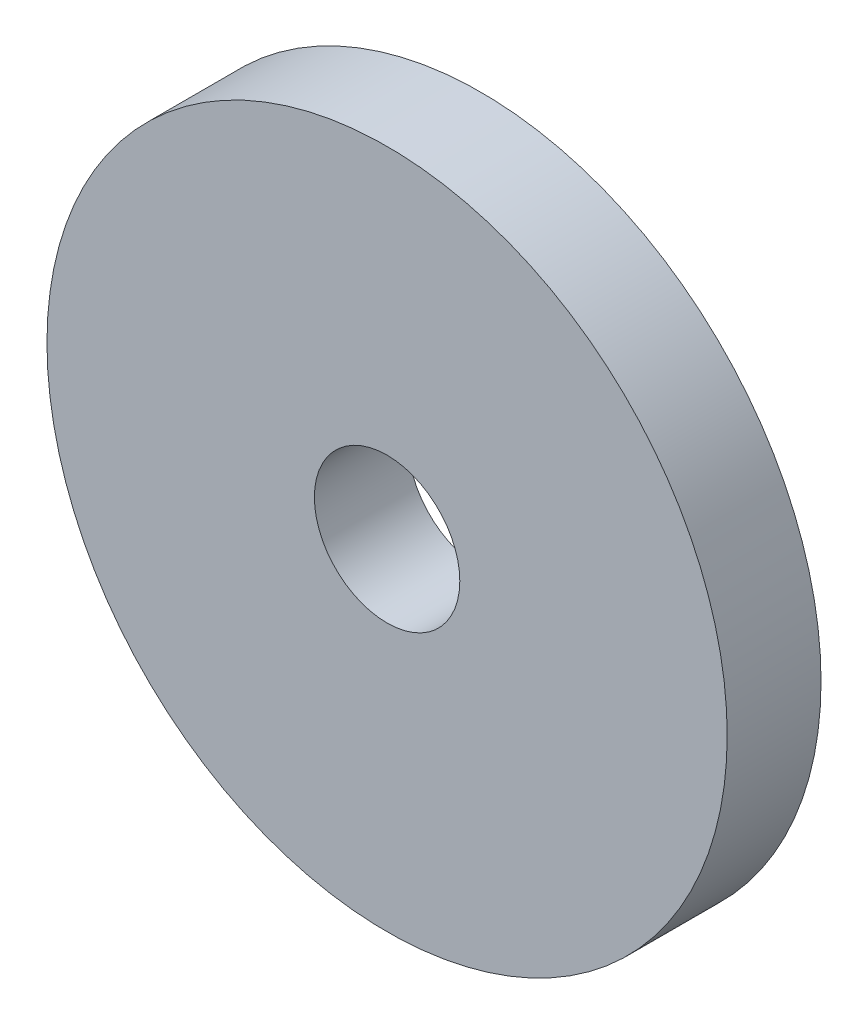
ISO-10303-21;
HEADER;
FILE_DESCRIPTION(('STEP AP214'),'2;1');
FILE_NAME('part.step','',(''),(''),'','','');
FILE_SCHEMA(('AUTOMOTIVE_DESIGN { 1 0 10303 214 1 1 1 1 }'));
ENDSEC;
DATA;
#1=APPLICATION_CONTEXT('core data for automotive mechanical design processes');
#2=APPLICATION_PROTOCOL_DEFINITION('international standard','automotive_design',2000,#1);
#3=PRODUCT_CONTEXT('',#1,'mechanical');
#4=PRODUCT('Part','Part','',(#3));
#5=PRODUCT_RELATED_PRODUCT_CATEGORY('part','',(#4));
#6=PRODUCT_DEFINITION_FORMATION('','',#4);
#7=PRODUCT_DEFINITION_CONTEXT('part definition',#1,'design');
#8=PRODUCT_DEFINITION('design','',#6,#7);
#9=PRODUCT_DEFINITION_SHAPE('','',#8);
#10=(LENGTH_UNIT() NAMED_UNIT(*) SI_UNIT(.MILLI.,.METRE.));
#11=(NAMED_UNIT(*) PLANE_ANGLE_UNIT() SI_UNIT($,.RADIAN.));
#12=(NAMED_UNIT(*) SI_UNIT($,.STERADIAN.) SOLID_ANGLE_UNIT());
#13=UNCERTAINTY_MEASURE_WITH_UNIT(LENGTH_MEASURE(1.E-05),#10,'distance_accuracy_value','');
#14=(GEOMETRIC_REPRESENTATION_CONTEXT(3) GLOBAL_UNCERTAINTY_ASSIGNED_CONTEXT((#13)) GLOBAL_UNIT_ASSIGNED_CONTEXT((#10,
#11,#12)) REPRESENTATION_CONTEXT('',''));
#15=CARTESIAN_POINT('',(0.,0.,0.));
#16=DIRECTION('',(0.,0.,1.));
#17=DIRECTION('',(1.,0.,0.));
#18=AXIS2_PLACEMENT_3D('',#15,#16,#17);
#19=CARTESIAN_POINT('',(0.,0.,2.));
#20=DIRECTION('',(0.,0.,-1.));
#21=DIRECTION('',(-1.,0.,0.));
#22=AXIS2_PLACEMENT_3D('',#19,#20,#21);
#23=CYLINDRICAL_SURFACE('',#22,7.25);
#24=CARTESIAN_POINT('',(0.,0.,2.));
#25=DIRECTION('',(0.,0.,1.));
#26=DIRECTION('',(1.,0.,0.));
#27=AXIS2_PLACEMENT_3D('',#24,#25,#26);
#28=CIRCLE('',#27,7.25);
#29=CARTESIAN_POINT('',(7.25,0.,2.));
#30=VERTEX_POINT('',#29);
#31=EDGE_CURVE('E10',#30,#30,#28,.T.);
#32=ORIENTED_EDGE('',*,*,#31,.F.);
#33=EDGE_LOOP('',(#32));
#34=FACE_BOUND('',#33,.T.);
#35=CARTESIAN_POINT('',(0.,0.,0.));
#36=DIRECTION('',(0.,0.,1.));
#37=DIRECTION('',(1.,0.,0.));
#38=AXIS2_PLACEMENT_3D('',#35,#36,#37);
#39=CIRCLE('',#38,7.25);
#40=CARTESIAN_POINT('',(7.25,0.,0.));
#41=VERTEX_POINT('',#40);
#42=EDGE_CURVE('E44',#41,#41,#39,.T.);
#43=ORIENTED_EDGE('',*,*,#42,.T.);
#44=EDGE_LOOP('',(#43));
#45=FACE_BOUND('',#44,.T.);
#46=ADVANCED_FACE('F41',(#34,#45),#23,.T.);
#47=CARTESIAN_POINT('',(0.,0.,2.));
#48=DIRECTION('',(0.,0.,1.));
#49=DIRECTION('',(1.,0.,0.));
#50=AXIS2_PLACEMENT_3D('',#47,#48,#49);
#51=PLANE('',#50);
#52=CARTESIAN_POINT('',(0.,0.,2.));
#53=DIRECTION('',(0.,0.,1.));
#54=DIRECTION('',(1.,0.,0.));
#55=AXIS2_PLACEMENT_3D('',#52,#53,#54);
#56=CIRCLE('',#55,1.55);
#57=CARTESIAN_POINT('',(1.55,0.,2.));
#58=VERTEX_POINT('',#57);
#59=EDGE_CURVE('E53',#58,#58,#56,.T.);
#60=ORIENTED_EDGE('',*,*,#59,.F.);
#61=EDGE_LOOP('',(#60));
#62=FACE_BOUND('',#61,.T.);
#63=ORIENTED_EDGE('',*,*,#31,.T.);
#64=EDGE_LOOP('',(#63));
#65=FACE_BOUND('',#64,.T.);
#66=ADVANCED_FACE('F68',(#62,#65),#51,.T.);
#67=CARTESIAN_POINT('',(0.,0.,0.));
#68=DIRECTION('',(0.,0.,1.));
#69=DIRECTION('',(1.,0.,0.));
#70=AXIS2_PLACEMENT_3D('',#67,#68,#69);
#71=PLANE('',#70);
#72=CARTESIAN_POINT('',(0.,0.,0.));
#73=DIRECTION('',(0.,0.,-1.));
#74=DIRECTION('',(-1.,0.,0.));
#75=AXIS2_PLACEMENT_3D('',#72,#73,#74);
#76=CIRCLE('',#75,1.55);
#77=CARTESIAN_POINT('',(-1.55,0.,0.));
#78=VERTEX_POINT('',#77);
#79=EDGE_CURVE('E58',#78,#78,#76,.T.);
#80=ORIENTED_EDGE('',*,*,#79,.F.);
#81=EDGE_LOOP('',(#80));
#82=FACE_BOUND('',#81,.T.);
#83=ORIENTED_EDGE('',*,*,#42,.F.);
#84=EDGE_LOOP('',(#83));
#85=FACE_BOUND('',#84,.T.);
#86=ADVANCED_FACE('F65',(#82,#85),#71,.F.);
#87=CARTESIAN_POINT('',(0.,0.,4.5));
#88=DIRECTION('',(0.,0.,-1.));
#89=DIRECTION('',(-1.,0.,0.));
#90=AXIS2_PLACEMENT_3D('',#87,#88,#89);
#91=CYLINDRICAL_SURFACE('',#90,1.55);
#92=ORIENTED_EDGE('',*,*,#59,.T.);
#93=EDGE_LOOP('',(#92));
#94=FACE_BOUND('',#93,.T.);
#95=ORIENTED_EDGE('',*,*,#79,.T.);
#96=EDGE_LOOP('',(#95));
#97=FACE_BOUND('',#96,.T.);
#98=ADVANCED_FACE('F63',(#94,#97),#91,.F.);
#99=CLOSED_SHELL('',(#46,#66,#86,#98));
#100=MANIFOLD_SOLID_BREP('B2',#99);
#101=ADVANCED_BREP_SHAPE_REPRESENTATION('',(#18,#100),#14);
#102=SHAPE_DEFINITION_REPRESENTATION(#9,#101);
ENDSEC;
END-ISO-10303-21;
